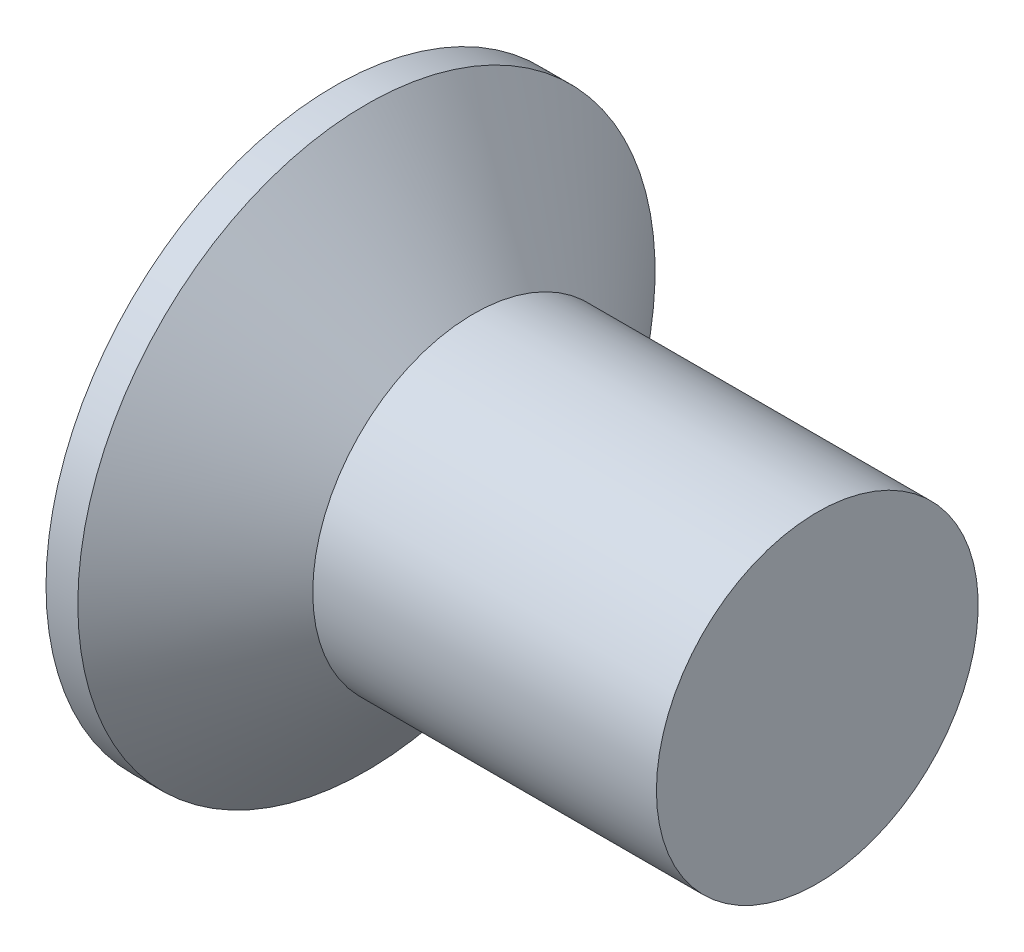
ISO-10303-21;
HEADER;
FILE_DESCRIPTION(('STEP AP214'),'2;1');
FILE_NAME('part.step','',(''),(''),'','','');
FILE_SCHEMA(('AUTOMOTIVE_DESIGN { 1 0 10303 214 1 1 1 1 }'));
ENDSEC;
DATA;
#1=APPLICATION_CONTEXT('core data for automotive mechanical design processes');
#2=APPLICATION_PROTOCOL_DEFINITION('international standard','automotive_design',2000,#1);
#3=PRODUCT_CONTEXT('',#1,'mechanical');
#4=PRODUCT('Part','Part','',(#3));
#5=PRODUCT_RELATED_PRODUCT_CATEGORY('part','',(#4));
#6=PRODUCT_DEFINITION_FORMATION('','',#4);
#7=PRODUCT_DEFINITION_CONTEXT('part definition',#1,'design');
#8=PRODUCT_DEFINITION('design','',#6,#7);
#9=PRODUCT_DEFINITION_SHAPE('','',#8);
#10=(LENGTH_UNIT() NAMED_UNIT(*) SI_UNIT(.MILLI.,.METRE.));
#11=(NAMED_UNIT(*) PLANE_ANGLE_UNIT() SI_UNIT($,.RADIAN.));
#12=(NAMED_UNIT(*) SI_UNIT($,.STERADIAN.) SOLID_ANGLE_UNIT());
#13=UNCERTAINTY_MEASURE_WITH_UNIT(LENGTH_MEASURE(1.E-05),#10,'distance_accuracy_value','');
#14=(GEOMETRIC_REPRESENTATION_CONTEXT(3) GLOBAL_UNCERTAINTY_ASSIGNED_CONTEXT((#13)) GLOBAL_UNIT_ASSIGNED_CONTEXT((#10,
#11,#12)) REPRESENTATION_CONTEXT('',''));
#15=CARTESIAN_POINT('',(0.,0.,0.));
#16=DIRECTION('',(0.,0.,1.));
#17=DIRECTION('',(1.,0.,0.));
#18=AXIS2_PLACEMENT_3D('',#15,#16,#17);
#19=CARTESIAN_POINT('',(0.,0.,0.));
#20=DIRECTION('',(-1.,0.,0.));
#21=DIRECTION('',(0.,0.,1.));
#22=AXIS2_PLACEMENT_3D('',#19,#20,#21);
#23=PLANE('',#22);
#24=CARTESIAN_POINT('',(0.,0.,0.));
#25=DIRECTION('',(-1.,0.,0.));
#26=DIRECTION('',(0.,0.,1.));
#27=AXIS2_PLACEMENT_3D('',#24,#25,#26);
#28=CIRCLE('',#27,11.3919);
#29=CARTESIAN_POINT('',(0.,0.,11.3919));
#30=VERTEX_POINT('',#29);
#31=EDGE_CURVE('E40',#30,#30,#28,.T.);
#32=ORIENTED_EDGE('',*,*,#31,.T.);
#33=EDGE_LOOP('',(#32));
#34=FACE_BOUND('',#33,.T.);
#35=DIRECTION('',(0.,1.,0.));
#36=VECTOR('',#35,1.);
#37=CARTESIAN_POINT('',(0.,-7.1501,-1.1811));
#38=LINE('',#37,#36);
#39=CARTESIAN_POINT('',(0.,-7.1501,-1.1811));
#40=VERTEX_POINT('',#39);
#41=CARTESIAN_POINT('',(0.,-1.1811,-1.1811));
#42=VERTEX_POINT('',#41);
#43=EDGE_CURVE('E101',#40,#42,#38,.T.);
#44=ORIENTED_EDGE('',*,*,#43,.T.);
#45=DIRECTION('',(0.,0.,-1.));
#46=VECTOR('',#45,1.);
#47=CARTESIAN_POINT('',(0.,-1.18110000000002,7.15009999999999));
#48=LINE('',#47,#46);
#49=CARTESIAN_POINT('',(0.,-1.18109999999998,-7.1501));
#50=VERTEX_POINT('',#49);
#51=EDGE_CURVE('E81',#42,#50,#48,.T.);
#52=ORIENTED_EDGE('',*,*,#51,.T.);
#53=DIRECTION('',(0.,1.,0.));
#54=VECTOR('',#53,1.);
#55=CARTESIAN_POINT('',(0.,-1.18109999999998,-7.1501));
#56=LINE('',#55,#54);
#57=CARTESIAN_POINT('',(0.,1.18110000000002,-7.15009999999999));
#58=VERTEX_POINT('',#57);
#59=EDGE_CURVE('E336',#50,#58,#56,.T.);
#60=ORIENTED_EDGE('',*,*,#59,.T.);
#61=DIRECTION('',(0.,0.,1.));
#62=VECTOR('',#61,1.);
#63=CARTESIAN_POINT('',(0.,1.18110000000002,-7.15009999999999));
#64=LINE('',#63,#62);
#65=CARTESIAN_POINT('',(0.,1.1811,-1.1811));
#66=VERTEX_POINT('',#65);
#67=EDGE_CURVE('E97',#58,#66,#64,.T.);
#68=ORIENTED_EDGE('',*,*,#67,.T.);
#69=CARTESIAN_POINT('',(0.,7.1501,-1.1811));
#70=VERTEX_POINT('',#69);
#71=EDGE_CURVE('E91',#66,#70,#38,.T.);
#72=ORIENTED_EDGE('',*,*,#71,.T.);
#73=DIRECTION('',(0.,0.,1.));
#74=VECTOR('',#73,1.);
#75=CARTESIAN_POINT('',(0.,7.1501,-1.1811));
#76=LINE('',#75,#74);
#77=CARTESIAN_POINT('',(0.,7.1501,1.1811));
#78=VERTEX_POINT('',#77);
#79=EDGE_CURVE('E94',#70,#78,#76,.T.);
#80=ORIENTED_EDGE('',*,*,#79,.T.);
#81=DIRECTION('',(0.,-1.,0.));
#82=VECTOR('',#81,1.);
#83=CARTESIAN_POINT('',(0.,7.1501,1.1811));
#84=LINE('',#83,#82);
#85=CARTESIAN_POINT('',(0.,1.1811,1.1811));
#86=VERTEX_POINT('',#85);
#87=EDGE_CURVE('E348',#78,#86,#84,.T.);
#88=ORIENTED_EDGE('',*,*,#87,.T.);
#89=CARTESIAN_POINT('',(0.,1.18109999999997,7.1501));
#90=VERTEX_POINT('',#89);
#91=EDGE_CURVE('E331',#86,#90,#64,.T.);
#92=ORIENTED_EDGE('',*,*,#91,.T.);
#93=DIRECTION('',(0.,-1.,0.));
#94=VECTOR('',#93,1.);
#95=CARTESIAN_POINT('',(0.,1.18109999999997,7.1501));
#96=LINE('',#95,#94);
#97=CARTESIAN_POINT('',(0.,-1.18110000000002,7.15009999999999));
#98=VERTEX_POINT('',#97);
#99=EDGE_CURVE('E317',#90,#98,#96,.T.);
#100=ORIENTED_EDGE('',*,*,#99,.T.);
#101=CARTESIAN_POINT('',(0.,-1.1811,1.1811));
#102=VERTEX_POINT('',#101);
#103=EDGE_CURVE('E329',#98,#102,#48,.T.);
#104=ORIENTED_EDGE('',*,*,#103,.T.);
#105=CARTESIAN_POINT('',(0.,-7.1501,1.1811));
#106=VERTEX_POINT('',#105);
#107=EDGE_CURVE('E107',#102,#106,#84,.T.);
#108=ORIENTED_EDGE('',*,*,#107,.T.);
#109=DIRECTION('',(0.,0.,-1.));
#110=VECTOR('',#109,1.);
#111=CARTESIAN_POINT('',(0.,-7.1501,1.1811));
#112=LINE('',#111,#110);
#113=EDGE_CURVE('E130',#106,#40,#112,.T.);
#114=ORIENTED_EDGE('',*,*,#113,.T.);
#115=EDGE_LOOP('',(#44,#52,#60,#68,#72,#80,#88,#92,#100,#104,#108,#114));
#116=FACE_BOUND('',#115,.T.);
#117=ADVANCED_FACE('F33',(#34,#116),#23,.T.);
#118=CARTESIAN_POINT('',(10.1610327202323,0.,0.53738334946757));
#119=DIRECTION('',(-0.0632247521801606,0.,-0.99799931398361));
#120=DIRECTION('',(-0.997999313983611,0.,0.0632247521801606));
#121=AXIS2_PLACEMENT_3D('',#118,#119,#120);
#122=PLANE('',#121);
#123=ORIENTED_EDGE('',*,*,#107,.F.);
#124=DIRECTION('',(0.996010588350832,0.0630987634309453,-0.0630987634309451));
#125=VECTOR('',#124,1.);
#126=CARTESIAN_POINT('',(10.1948056712049,-0.535243782410043,0.535243782410041));
#127=LINE('',#126,#125);
#128=CARTESIAN_POINT('',(9.3218,-0.590550000000002,0.590549999999997));
#129=VERTEX_POINT('',#128);
#130=EDGE_CURVE('E125',#102,#129,#127,.T.);
#131=ORIENTED_EDGE('',*,*,#130,.T.);
#132=DIRECTION('',(0.816720717857712,0.574708788519766,-0.0517404814446644));
#133=VECTOR('',#132,1.);
#134=CARTESIAN_POINT('',(0.,-7.1501,1.1811));
#135=LINE('',#134,#133);
#136=EDGE_CURVE('E102',#106,#129,#135,.T.);
#137=ORIENTED_EDGE('',*,*,#136,.F.);
#138=EDGE_LOOP('',(#123,#131,#137));
#139=FACE_BOUND('',#138,.T.);
#140=ADVANCED_FACE('F153',(#139),#122,.T.);
#141=DIRECTION('',(0.816720717857712,-0.574708788519766,-0.0517404814446643));
#142=VECTOR('',#141,1.);
#143=CARTESIAN_POINT('',(0.,7.1501,1.1811));
#144=LINE('',#143,#142);
#145=CARTESIAN_POINT('',(9.3218,0.590549999999999,0.59055));
#146=VERTEX_POINT('',#145);
#147=EDGE_CURVE('E47',#78,#146,#144,.T.);
#148=ORIENTED_EDGE('',*,*,#147,.T.);
#149=DIRECTION('',(-0.996010588350832,0.0630987634309448,0.0630987634309451));
#150=VECTOR('',#149,1.);
#151=CARTESIAN_POINT('',(10.1948056712049,0.535243782410039,0.535243782410041));
#152=LINE('',#151,#150);
#153=EDGE_CURVE('E344',#146,#86,#152,.T.);
#154=ORIENTED_EDGE('',*,*,#153,.T.);
#155=ORIENTED_EDGE('',*,*,#87,.F.);
#156=EDGE_LOOP('',(#148,#154,#155));
#157=FACE_BOUND('',#156,.T.);
#158=ADVANCED_FACE('F157',(#157),#122,.T.);
#159=CARTESIAN_POINT('',(10.1610327202323,0.,-0.53738334946757));
#160=DIRECTION('',(-0.0632247521801606,0.,0.99799931398361));
#161=DIRECTION('',(0.997999313983611,0.,0.0632247521801606));
#162=AXIS2_PLACEMENT_3D('',#159,#160,#161);
#163=PLANE('',#162);
#164=DIRECTION('',(0.816720717857712,0.574708788519766,0.0517404814446643));
#165=VECTOR('',#164,1.);
#166=CARTESIAN_POINT('',(0.,-7.1501,-1.1811));
#167=LINE('',#166,#165);
#168=CARTESIAN_POINT('',(9.3218,-0.590549999999998,-0.590550000000002));
#169=VERTEX_POINT('',#168);
#170=EDGE_CURVE('E56',#40,#169,#167,.T.);
#171=ORIENTED_EDGE('',*,*,#170,.T.);
#172=DIRECTION('',(-0.996010588350832,-0.0630987634309449,-0.0630987634309451));
#173=VECTOR('',#172,1.);
#174=CARTESIAN_POINT('',(10.1948056712049,-0.535243782410039,-0.535243782410041));
#175=LINE('',#174,#173);
#176=EDGE_CURVE('E11',#169,#42,#175,.T.);
#177=ORIENTED_EDGE('',*,*,#176,.T.);
#178=ORIENTED_EDGE('',*,*,#43,.F.);
#179=EDGE_LOOP('',(#171,#177,#178));
#180=FACE_BOUND('',#179,.T.);
#181=ADVANCED_FACE('F150',(#180),#163,.T.);
#182=ORIENTED_EDGE('',*,*,#71,.F.);
#183=DIRECTION('',(0.996010588350832,-0.0630987634309453,0.0630987634309451));
#184=VECTOR('',#183,1.);
#185=CARTESIAN_POINT('',(10.1948056712049,0.535243782410043,-0.535243782410041));
#186=LINE('',#185,#184);
#187=CARTESIAN_POINT('',(9.3218,0.590549999999999,-0.59055));
#188=VERTEX_POINT('',#187);
#189=EDGE_CURVE('E110',#66,#188,#186,.T.);
#190=ORIENTED_EDGE('',*,*,#189,.T.);
#191=DIRECTION('',(0.816720717857712,-0.574708788519766,0.0517404814446643));
#192=VECTOR('',#191,1.);
#193=CARTESIAN_POINT('',(0.,7.1501,-1.1811));
#194=LINE('',#193,#192);
#195=EDGE_CURVE('E106',#70,#188,#194,.T.);
#196=ORIENTED_EDGE('',*,*,#195,.F.);
#197=EDGE_LOOP('',(#182,#190,#196));
#198=FACE_BOUND('',#197,.T.);
#199=ADVANCED_FACE('F109',(#198),#163,.T.);
#200=CARTESIAN_POINT('',(-6.34999999999999,0.,0.));
#201=DIRECTION('',(-1.,0.,0.));
#202=DIRECTION('',(0.,0.,1.));
#203=AXIS2_PLACEMENT_3D('',#200,#201,#202);
#204=CYLINDRICAL_SURFACE('',#203,11.3919);
#205=CARTESIAN_POINT('',(1.25574356956729,0.,0.));
#206=DIRECTION('',(-1.,0.,0.));
#207=DIRECTION('',(0.,0.,1.));
#208=AXIS2_PLACEMENT_3D('',#205,#206,#207);
#209=CIRCLE('',#208,11.3919);
#210=CARTESIAN_POINT('',(1.25574356956729,0.,11.3919));
#211=VERTEX_POINT('',#210);
#212=EDGE_CURVE('E133',#211,#211,#209,.T.);
#213=ORIENTED_EDGE('',*,*,#212,.T.);
#214=EDGE_LOOP('',(#213));
#215=FACE_BOUND('',#214,.T.);
#216=ORIENTED_EDGE('',*,*,#31,.F.);
#217=EDGE_LOOP('',(#216));
#218=FACE_BOUND('',#217,.T.);
#219=ADVANCED_FACE('F139',(#215,#218),#204,.T.);
#220=CARTESIAN_POINT('',(1.25574356956729,0.,0.));
#221=DIRECTION('',(-1.,0.,0.));
#222=DIRECTION('',(0.,0.,1.));
#223=AXIS2_PLACEMENT_3D('',#220,#221,#222);
#224=CONICAL_SURFACE('',#223,11.3919,0.872664625997166);
#225=CARTESIAN_POINT('',(5.4864,0.,0.));
#226=DIRECTION('',(-1.,0.,0.));
#227=DIRECTION('',(0.,0.,1.));
#228=AXIS2_PLACEMENT_3D('',#225,#226,#227);
#229=CIRCLE('',#228,6.35);
#230=CARTESIAN_POINT('',(5.4864,0.,6.35));
#231=VERTEX_POINT('',#230);
#232=EDGE_CURVE('E129',#231,#231,#229,.T.);
#233=ORIENTED_EDGE('',*,*,#232,.T.);
#234=EDGE_LOOP('',(#233));
#235=FACE_BOUND('',#234,.T.);
#236=ORIENTED_EDGE('',*,*,#212,.F.);
#237=EDGE_LOOP('',(#236));
#238=FACE_BOUND('',#237,.T.);
#239=ADVANCED_FACE('F141',(#235,#238),#224,.T.);
#240=CARTESIAN_POINT('',(-6.34999999999999,0.,0.));
#241=DIRECTION('',(-1.,0.,0.));
#242=DIRECTION('',(0.,0.,1.));
#243=AXIS2_PLACEMENT_3D('',#240,#241,#242);
#244=CYLINDRICAL_SURFACE('',#243,6.35);
#245=CARTESIAN_POINT('',(19.05,0.,0.));
#246=DIRECTION('',(-1.,0.,0.));
#247=DIRECTION('',(0.,0.,1.));
#248=AXIS2_PLACEMENT_3D('',#245,#246,#247);
#249=CIRCLE('',#248,6.35);
#250=CARTESIAN_POINT('',(19.05,0.,6.35));
#251=VERTEX_POINT('',#250);
#252=EDGE_CURVE('E126',#251,#251,#249,.T.);
#253=ORIENTED_EDGE('',*,*,#252,.T.);
#254=EDGE_LOOP('',(#253));
#255=FACE_BOUND('',#254,.T.);
#256=ORIENTED_EDGE('',*,*,#232,.F.);
#257=EDGE_LOOP('',(#256));
#258=FACE_BOUND('',#257,.T.);
#259=ADVANCED_FACE('F147',(#255,#258),#244,.T.);
#260=CARTESIAN_POINT('',(19.05,6.35,0.));
#261=DIRECTION('',(1.,0.,0.));
#262=DIRECTION('',(0.,0.,-1.));
#263=AXIS2_PLACEMENT_3D('',#260,#261,#262);
#264=PLANE('',#263);
#265=ORIENTED_EDGE('',*,*,#252,.F.);
#266=EDGE_LOOP('',(#265));
#267=FACE_BOUND('',#266,.T.);
#268=ADVANCED_FACE('F177',(#267),#264,.T.);
#269=CARTESIAN_POINT('',(9.3218,0.59055,-0.59055));
#270=DIRECTION('',(1.,0.,0.));
#271=DIRECTION('',(0.,0.,-1.));
#272=AXIS2_PLACEMENT_3D('',#269,#270,#271);
#273=PLANE('',#272);
#274=DIRECTION('',(0.,1.,0.));
#275=VECTOR('',#274,1.);
#276=CARTESIAN_POINT('',(9.3218,-0.59055,-0.59055));
#277=LINE('',#276,#275);
#278=EDGE_CURVE('E121',#169,#188,#277,.T.);
#279=ORIENTED_EDGE('',*,*,#278,.F.);
#280=DIRECTION('',(0.,0.,-1.));
#281=VECTOR('',#280,1.);
#282=CARTESIAN_POINT('',(9.3218,-0.59055,0.59055));
#283=LINE('',#282,#281);
#284=EDGE_CURVE('E112',#129,#169,#283,.T.);
#285=ORIENTED_EDGE('',*,*,#284,.F.);
#286=DIRECTION('',(0.,-1.,0.));
#287=VECTOR('',#286,1.);
#288=CARTESIAN_POINT('',(9.3218,0.59055,0.59055));
#289=LINE('',#288,#287);
#290=EDGE_CURVE('E115',#146,#129,#289,.T.);
#291=ORIENTED_EDGE('',*,*,#290,.F.);
#292=DIRECTION('',(0.,0.,1.));
#293=VECTOR('',#292,1.);
#294=CARTESIAN_POINT('',(9.3218,0.59055,-0.59055));
#295=LINE('',#294,#293);
#296=EDGE_CURVE('E119',#188,#146,#295,.T.);
#297=ORIENTED_EDGE('',*,*,#296,.F.);
#298=EDGE_LOOP('',(#279,#285,#291,#297));
#299=FACE_BOUND('',#298,.T.);
#300=ADVANCED_FACE('F174',(#299),#273,.F.);
#301=CARTESIAN_POINT('',(9.3218,-0.59055,-0.59055));
#302=DIRECTION('',(-0.57547960648046,0.817816130022571,0.));
#303=DIRECTION('',(-0.817816130022571,-0.57547960648046,0.));
#304=AXIS2_PLACEMENT_3D('',#301,#302,#303);
#305=PLANE('',#304);
#306=ORIENTED_EDGE('',*,*,#170,.F.);
#307=ORIENTED_EDGE('',*,*,#113,.F.);
#308=ORIENTED_EDGE('',*,*,#136,.T.);
#309=ORIENTED_EDGE('',*,*,#284,.T.);
#310=EDGE_LOOP('',(#306,#307,#308,#309));
#311=FACE_BOUND('',#310,.T.);
#312=ADVANCED_FACE('F166',(#311),#305,.T.);
#313=CARTESIAN_POINT('',(9.3218,0.59055,0.59055));
#314=DIRECTION('',(-0.57547960648046,-0.817816130022571,0.));
#315=DIRECTION('',(0.817816130022571,-0.57547960648046,0.));
#316=AXIS2_PLACEMENT_3D('',#313,#314,#315);
#317=PLANE('',#316);
#318=ORIENTED_EDGE('',*,*,#147,.F.);
#319=ORIENTED_EDGE('',*,*,#79,.F.);
#320=ORIENTED_EDGE('',*,*,#195,.T.);
#321=ORIENTED_EDGE('',*,*,#296,.T.);
#322=EDGE_LOOP('',(#318,#319,#320,#321));
#323=FACE_BOUND('',#322,.T.);
#324=ADVANCED_FACE('F105',(#323),#317,.T.);
#325=CARTESIAN_POINT('',(10.1610327202323,-0.53738334946757,0.));
#326=DIRECTION('',(-0.0632247521801606,0.99799931398361,0.));
#327=DIRECTION('',(-0.997999313983611,-0.0632247521801606,0.));
#328=AXIS2_PLACEMENT_3D('',#325,#326,#327);
#329=PLANE('',#328);
#330=DIRECTION('',(0.816720717857712,0.0517404814446624,0.574708788519766));
#331=VECTOR('',#330,1.);
#332=CARTESIAN_POINT('',(0.,-1.18109999999998,-7.1501));
#333=LINE('',#332,#331);
#334=EDGE_CURVE('E338',#50,#169,#333,.T.);
#335=ORIENTED_EDGE('',*,*,#334,.F.);
#336=ORIENTED_EDGE('',*,*,#51,.F.);
#337=ORIENTED_EDGE('',*,*,#176,.F.);
#338=EDGE_LOOP('',(#335,#336,#337));
#339=FACE_BOUND('',#338,.T.);
#340=ADVANCED_FACE('F173',(#339),#329,.T.);
#341=CARTESIAN_POINT('',(10.1610327202323,0.53738334946757,0.));
#342=DIRECTION('',(-0.0632247521801606,-0.99799931398361,0.));
#343=DIRECTION('',(0.997999313983611,-0.0632247521801606,0.));
#344=AXIS2_PLACEMENT_3D('',#341,#342,#343);
#345=PLANE('',#344);
#346=ORIENTED_EDGE('',*,*,#67,.F.);
#347=DIRECTION('',(0.816720717857712,-0.0517404814446663,0.574708788519766));
#348=VECTOR('',#347,1.);
#349=CARTESIAN_POINT('',(0.,1.18110000000002,-7.15009999999999));
#350=LINE('',#349,#348);
#351=EDGE_CURVE('E72',#58,#188,#350,.T.);
#352=ORIENTED_EDGE('',*,*,#351,.T.);
#353=ORIENTED_EDGE('',*,*,#189,.F.);
#354=EDGE_LOOP('',(#346,#352,#353));
#355=FACE_BOUND('',#354,.T.);
#356=ADVANCED_FACE('F217',(#355),#345,.T.);
#357=CARTESIAN_POINT('',(9.3218,0.590550000000002,-0.590549999999998));
#358=DIRECTION('',(-0.57547960648046,0.,0.817816130022571));
#359=DIRECTION('',(-0.817816130022571,0.,-0.57547960648046));
#360=AXIS2_PLACEMENT_3D('',#357,#358,#359);
#361=PLANE('',#360);
#362=ORIENTED_EDGE('',*,*,#351,.F.);
#363=ORIENTED_EDGE('',*,*,#59,.F.);
#364=ORIENTED_EDGE('',*,*,#334,.T.);
#365=ORIENTED_EDGE('',*,*,#278,.T.);
#366=EDGE_LOOP('',(#362,#363,#364,#365));
#367=FACE_BOUND('',#366,.T.);
#368=ADVANCED_FACE('F225',(#367),#361,.T.);
#369=ORIENTED_EDGE('',*,*,#103,.F.);
#370=DIRECTION('',(0.816720717857712,0.0517404814446663,-0.574708788519766));
#371=VECTOR('',#370,1.);
#372=CARTESIAN_POINT('',(0.,-1.18110000000002,7.15009999999999));
#373=LINE('',#372,#371);
#374=EDGE_CURVE('E314',#98,#129,#373,.T.);
#375=ORIENTED_EDGE('',*,*,#374,.T.);
#376=ORIENTED_EDGE('',*,*,#130,.F.);
#377=EDGE_LOOP('',(#369,#375,#376));
#378=FACE_BOUND('',#377,.T.);
#379=ADVANCED_FACE('F219',(#378),#329,.T.);
#380=DIRECTION('',(0.816720717857712,-0.0517404814446623,-0.574708788519766));
#381=VECTOR('',#380,1.);
#382=CARTESIAN_POINT('',(0.,1.18109999999997,7.1501));
#383=LINE('',#382,#381);
#384=EDGE_CURVE('E325',#90,#146,#383,.T.);
#385=ORIENTED_EDGE('',*,*,#384,.F.);
#386=ORIENTED_EDGE('',*,*,#91,.F.);
#387=ORIENTED_EDGE('',*,*,#153,.F.);
#388=EDGE_LOOP('',(#385,#386,#387));
#389=FACE_BOUND('',#388,.T.);
#390=ADVANCED_FACE('F227',(#389),#345,.T.);
#391=CARTESIAN_POINT('',(9.3218,-0.590550000000002,0.590549999999998));
#392=DIRECTION('',(-0.57547960648046,0.,-0.817816130022571));
#393=DIRECTION('',(0.817816130022571,0.,-0.57547960648046));
#394=AXIS2_PLACEMENT_3D('',#391,#392,#393);
#395=PLANE('',#394);
#396=ORIENTED_EDGE('',*,*,#374,.F.);
#397=ORIENTED_EDGE('',*,*,#99,.F.);
#398=ORIENTED_EDGE('',*,*,#384,.T.);
#399=ORIENTED_EDGE('',*,*,#290,.T.);
#400=EDGE_LOOP('',(#396,#397,#398,#399));
#401=FACE_BOUND('',#400,.T.);
#402=ADVANCED_FACE('F246',(#401),#395,.T.);
#403=CLOSED_SHELL('',(#117,#140,#158,#181,#199,#219,#239,#259,#268,#300,#312,#324,#340,#356,
#368,#379,#390,#402));
#404=MANIFOLD_SOLID_BREP('B2',#403);
#405=ADVANCED_BREP_SHAPE_REPRESENTATION('',(#18,#404),#14);
#406=SHAPE_DEFINITION_REPRESENTATION(#9,#405);
ENDSEC;
END-ISO-10303-21;
